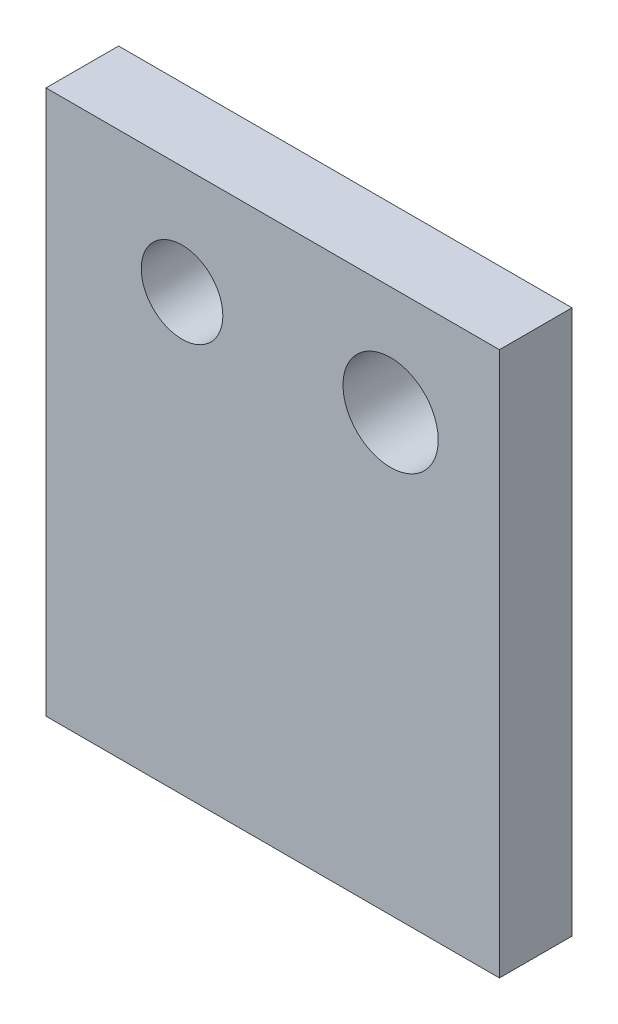
ISO-10303-21;
HEADER;
FILE_DESCRIPTION(('STEP AP214'),'2;1');
FILE_NAME('part.step','',(''),(''),'','','');
FILE_SCHEMA(('AUTOMOTIVE_DESIGN { 1 0 10303 214 1 1 1 1 }'));
ENDSEC;
DATA;
#1=APPLICATION_CONTEXT('core data for automotive mechanical design processes');
#2=APPLICATION_PROTOCOL_DEFINITION('international standard','automotive_design',2000,#1);
#3=PRODUCT_CONTEXT('',#1,'mechanical');
#4=PRODUCT('Part','Part','',(#3));
#5=PRODUCT_RELATED_PRODUCT_CATEGORY('part','',(#4));
#6=PRODUCT_DEFINITION_FORMATION('','',#4);
#7=PRODUCT_DEFINITION_CONTEXT('part definition',#1,'design');
#8=PRODUCT_DEFINITION('design','',#6,#7);
#9=PRODUCT_DEFINITION_SHAPE('','',#8);
#10=(LENGTH_UNIT() NAMED_UNIT(*) SI_UNIT(.MILLI.,.METRE.));
#11=(NAMED_UNIT(*) PLANE_ANGLE_UNIT() SI_UNIT($,.RADIAN.));
#12=(NAMED_UNIT(*) SI_UNIT($,.STERADIAN.) SOLID_ANGLE_UNIT());
#13=UNCERTAINTY_MEASURE_WITH_UNIT(LENGTH_MEASURE(1.E-05),#10,'distance_accuracy_value','');
#14=(GEOMETRIC_REPRESENTATION_CONTEXT(3) GLOBAL_UNCERTAINTY_ASSIGNED_CONTEXT((#13)) GLOBAL_UNIT_ASSIGNED_CONTEXT((#10,
#11,#12)) REPRESENTATION_CONTEXT('',''));
#15=CARTESIAN_POINT('',(0.,0.,0.));
#16=DIRECTION('',(0.,0.,1.));
#17=DIRECTION('',(1.,0.,0.));
#18=AXIS2_PLACEMENT_3D('',#15,#16,#17);
#19=CARTESIAN_POINT('',(0.,0.,8.));
#20=DIRECTION('',(0.,0.,-1.));
#21=DIRECTION('',(-1.,0.,0.));
#22=AXIS2_PLACEMENT_3D('',#19,#20,#21);
#23=PLANE('',#22);
#24=CARTESIAN_POINT('',(13.,18.,8.));
#25=DIRECTION('',(0.,0.,1.));
#26=DIRECTION('',(1.,0.,0.));
#27=AXIS2_PLACEMENT_3D('',#24,#25,#26);
#28=CIRCLE('',#27,5.25);
#29=CARTESIAN_POINT('',(18.25,18.,8.));
#30=VERTEX_POINT('',#29);
#31=EDGE_CURVE('E115',#30,#30,#28,.T.);
#32=ORIENTED_EDGE('',*,*,#31,.F.);
#33=EDGE_LOOP('',(#32));
#34=FACE_BOUND('',#33,.T.);
#35=DIRECTION('',(0.,1.,0.));
#36=VECTOR('',#35,1.);
#37=CARTESIAN_POINT('',(25.,-30.,8.));
#38=LINE('',#37,#36);
#39=CARTESIAN_POINT('',(25.,-30.,8.));
#40=VERTEX_POINT('',#39);
#41=CARTESIAN_POINT('',(25.,30.,8.));
#42=VERTEX_POINT('',#41);
#43=EDGE_CURVE('E85',#40,#42,#38,.T.);
#44=ORIENTED_EDGE('',*,*,#43,.T.);
#45=DIRECTION('',(-1.,0.,0.));
#46=VECTOR('',#45,1.);
#47=CARTESIAN_POINT('',(-25.,30.,8.));
#48=LINE('',#47,#46);
#49=CARTESIAN_POINT('',(-25.,30.,8.));
#50=VERTEX_POINT('',#49);
#51=EDGE_CURVE('E80',#42,#50,#48,.T.);
#52=ORIENTED_EDGE('',*,*,#51,.T.);
#53=DIRECTION('',(0.,-1.,0.));
#54=VECTOR('',#53,1.);
#55=CARTESIAN_POINT('',(-25.,-30.,8.));
#56=LINE('',#55,#54);
#57=CARTESIAN_POINT('',(-25.,-30.,8.));
#58=VERTEX_POINT('',#57);
#59=EDGE_CURVE('E83',#50,#58,#56,.T.);
#60=ORIENTED_EDGE('',*,*,#59,.T.);
#61=DIRECTION('',(1.,0.,0.));
#62=VECTOR('',#61,1.);
#63=CARTESIAN_POINT('',(-25.,-30.,8.));
#64=LINE('',#63,#62);
#65=EDGE_CURVE('E50',#58,#40,#64,.T.);
#66=ORIENTED_EDGE('',*,*,#65,.T.);
#67=EDGE_LOOP('',(#44,#52,#60,#66));
#68=FACE_BOUND('',#67,.T.);
#69=CARTESIAN_POINT('',(-10.,18.,8.));
#70=DIRECTION('',(0.,0.,1.));
#71=DIRECTION('',(1.,0.,0.));
#72=AXIS2_PLACEMENT_3D('',#69,#70,#71);
#73=CIRCLE('',#72,4.5);
#74=CARTESIAN_POINT('',(-5.50000000000001,18.,8.));
#75=VERTEX_POINT('',#74);
#76=EDGE_CURVE('E100',#75,#75,#73,.T.);
#77=ORIENTED_EDGE('',*,*,#76,.F.);
#78=EDGE_LOOP('',(#77));
#79=FACE_BOUND('',#78,.T.);
#80=ADVANCED_FACE('F33',(#34,#68,#79),#23,.F.);
#81=CARTESIAN_POINT('',(0.,0.,0.));
#82=DIRECTION('',(0.,0.,-1.));
#83=DIRECTION('',(-1.,0.,0.));
#84=AXIS2_PLACEMENT_3D('',#81,#82,#83);
#85=PLANE('',#84);
#86=CARTESIAN_POINT('',(13.,18.,0.));
#87=DIRECTION('',(0.,0.,1.));
#88=DIRECTION('',(1.,0.,0.));
#89=AXIS2_PLACEMENT_3D('',#86,#87,#88);
#90=CIRCLE('',#89,5.25);
#91=CARTESIAN_POINT('',(18.25,18.,0.));
#92=VERTEX_POINT('',#91);
#93=EDGE_CURVE('E118',#92,#92,#90,.T.);
#94=ORIENTED_EDGE('',*,*,#93,.T.);
#95=EDGE_LOOP('',(#94));
#96=FACE_BOUND('',#95,.T.);
#97=DIRECTION('',(0.,1.,0.));
#98=VECTOR('',#97,1.);
#99=CARTESIAN_POINT('',(25.,-30.,0.));
#100=LINE('',#99,#98);
#101=CARTESIAN_POINT('',(25.,-30.,0.));
#102=VERTEX_POINT('',#101);
#103=CARTESIAN_POINT('',(25.,30.,0.));
#104=VERTEX_POINT('',#103);
#105=EDGE_CURVE('E97',#102,#104,#100,.T.);
#106=ORIENTED_EDGE('',*,*,#105,.F.);
#107=DIRECTION('',(1.,0.,0.));
#108=VECTOR('',#107,1.);
#109=CARTESIAN_POINT('',(-25.,-30.,0.));
#110=LINE('',#109,#108);
#111=CARTESIAN_POINT('',(-25.,-30.,0.));
#112=VERTEX_POINT('',#111);
#113=EDGE_CURVE('E73',#112,#102,#110,.T.);
#114=ORIENTED_EDGE('',*,*,#113,.F.);
#115=DIRECTION('',(0.,-1.,0.));
#116=VECTOR('',#115,1.);
#117=CARTESIAN_POINT('',(-25.,-30.,0.));
#118=LINE('',#117,#116);
#119=CARTESIAN_POINT('',(-25.,30.,0.));
#120=VERTEX_POINT('',#119);
#121=EDGE_CURVE('E67',#120,#112,#118,.T.);
#122=ORIENTED_EDGE('',*,*,#121,.F.);
#123=DIRECTION('',(-1.,0.,0.));
#124=VECTOR('',#123,1.);
#125=CARTESIAN_POINT('',(-25.,30.,0.));
#126=LINE('',#125,#124);
#127=EDGE_CURVE('E89',#104,#120,#126,.T.);
#128=ORIENTED_EDGE('',*,*,#127,.F.);
#129=EDGE_LOOP('',(#106,#114,#122,#128));
#130=FACE_BOUND('',#129,.T.);
#131=CARTESIAN_POINT('',(-10.,18.,0.));
#132=DIRECTION('',(0.,0.,1.));
#133=DIRECTION('',(1.,0.,0.));
#134=AXIS2_PLACEMENT_3D('',#131,#132,#133);
#135=CIRCLE('',#134,4.5);
#136=CARTESIAN_POINT('',(-5.50000000000001,18.,0.));
#137=VERTEX_POINT('',#136);
#138=EDGE_CURVE('E112',#137,#137,#135,.T.);
#139=ORIENTED_EDGE('',*,*,#138,.T.);
#140=EDGE_LOOP('',(#139));
#141=FACE_BOUND('',#140,.T.);
#142=ADVANCED_FACE('F108',(#96,#130,#141),#85,.T.);
#143=CARTESIAN_POINT('',(25.,-30.,8.));
#144=DIRECTION('',(-1.,0.,0.));
#145=DIRECTION('',(0.,0.,1.));
#146=AXIS2_PLACEMENT_3D('',#143,#144,#145);
#147=PLANE('',#146);
#148=ORIENTED_EDGE('',*,*,#105,.T.);
#149=DIRECTION('',(0.,0.,-1.));
#150=VECTOR('',#149,1.);
#151=CARTESIAN_POINT('',(25.,30.,8.));
#152=LINE('',#151,#150);
#153=EDGE_CURVE('E11',#42,#104,#152,.T.);
#154=ORIENTED_EDGE('',*,*,#153,.F.);
#155=ORIENTED_EDGE('',*,*,#43,.F.);
#156=DIRECTION('',(0.,0.,-1.));
#157=VECTOR('',#156,1.);
#158=CARTESIAN_POINT('',(25.,-30.,8.));
#159=LINE('',#158,#157);
#160=EDGE_CURVE('E93',#40,#102,#159,.T.);
#161=ORIENTED_EDGE('',*,*,#160,.T.);
#162=EDGE_LOOP('',(#148,#154,#155,#161));
#163=FACE_BOUND('',#162,.T.);
#164=ADVANCED_FACE('F35',(#163),#147,.F.);
#165=CARTESIAN_POINT('',(-25.,30.,8.));
#166=DIRECTION('',(0.,-1.,0.));
#167=DIRECTION('',(0.,0.,-1.));
#168=AXIS2_PLACEMENT_3D('',#165,#166,#167);
#169=PLANE('',#168);
#170=ORIENTED_EDGE('',*,*,#127,.T.);
#171=DIRECTION('',(0.,0.,-1.));
#172=VECTOR('',#171,1.);
#173=CARTESIAN_POINT('',(-25.,30.,8.));
#174=LINE('',#173,#172);
#175=EDGE_CURVE('E42',#50,#120,#174,.T.);
#176=ORIENTED_EDGE('',*,*,#175,.F.);
#177=ORIENTED_EDGE('',*,*,#51,.F.);
#178=ORIENTED_EDGE('',*,*,#153,.T.);
#179=EDGE_LOOP('',(#170,#176,#177,#178));
#180=FACE_BOUND('',#179,.T.);
#181=ADVANCED_FACE('F88',(#180),#169,.F.);
#182=CARTESIAN_POINT('',(-25.,-30.,8.));
#183=DIRECTION('',(1.,0.,0.));
#184=DIRECTION('',(0.,0.,-1.));
#185=AXIS2_PLACEMENT_3D('',#182,#183,#184);
#186=PLANE('',#185);
#187=ORIENTED_EDGE('',*,*,#121,.T.);
#188=DIRECTION('',(0.,0.,-1.));
#189=VECTOR('',#188,1.);
#190=CARTESIAN_POINT('',(-25.,-30.,8.));
#191=LINE('',#190,#189);
#192=EDGE_CURVE('E90',#58,#112,#191,.T.);
#193=ORIENTED_EDGE('',*,*,#192,.F.);
#194=ORIENTED_EDGE('',*,*,#59,.F.);
#195=ORIENTED_EDGE('',*,*,#175,.T.);
#196=EDGE_LOOP('',(#187,#193,#194,#195));
#197=FACE_BOUND('',#196,.T.);
#198=ADVANCED_FACE('F91',(#197),#186,.F.);
#199=CARTESIAN_POINT('',(-25.,-30.,8.));
#200=DIRECTION('',(0.,1.,0.));
#201=DIRECTION('',(0.,0.,1.));
#202=AXIS2_PLACEMENT_3D('',#199,#200,#201);
#203=PLANE('',#202);
#204=ORIENTED_EDGE('',*,*,#113,.T.);
#205=ORIENTED_EDGE('',*,*,#160,.F.);
#206=ORIENTED_EDGE('',*,*,#65,.F.);
#207=ORIENTED_EDGE('',*,*,#192,.T.);
#208=EDGE_LOOP('',(#204,#205,#206,#207));
#209=FACE_BOUND('',#208,.T.);
#210=ADVANCED_FACE('F105',(#209),#203,.F.);
#211=CARTESIAN_POINT('',(-10.,18.,8.));
#212=DIRECTION('',(0.,0.,-1.));
#213=DIRECTION('',(-1.,0.,0.));
#214=AXIS2_PLACEMENT_3D('',#211,#212,#213);
#215=CYLINDRICAL_SURFACE('',#214,4.5);
#216=ORIENTED_EDGE('',*,*,#76,.T.);
#217=EDGE_LOOP('',(#216));
#218=FACE_BOUND('',#217,.T.);
#219=ORIENTED_EDGE('',*,*,#138,.F.);
#220=EDGE_LOOP('',(#219));
#221=FACE_BOUND('',#220,.T.);
#222=ADVANCED_FACE('F135',(#218,#221),#215,.F.);
#223=CARTESIAN_POINT('',(13.,18.,8.));
#224=DIRECTION('',(0.,0.,-1.));
#225=DIRECTION('',(-1.,0.,0.));
#226=AXIS2_PLACEMENT_3D('',#223,#224,#225);
#227=CYLINDRICAL_SURFACE('',#226,5.25);
#228=ORIENTED_EDGE('',*,*,#31,.T.);
#229=EDGE_LOOP('',(#228));
#230=FACE_BOUND('',#229,.T.);
#231=ORIENTED_EDGE('',*,*,#93,.F.);
#232=EDGE_LOOP('',(#231));
#233=FACE_BOUND('',#232,.T.);
#234=ADVANCED_FACE('F124',(#230,#233),#227,.F.);
#235=CLOSED_SHELL('',(#80,#142,#164,#181,#198,#210,#222,#234));
#236=MANIFOLD_SOLID_BREP('B2',#235);
#237=ADVANCED_BREP_SHAPE_REPRESENTATION('',(#18,#236),#14);
#238=SHAPE_DEFINITION_REPRESENTATION(#9,#237);
ENDSEC;
END-ISO-10303-21;
